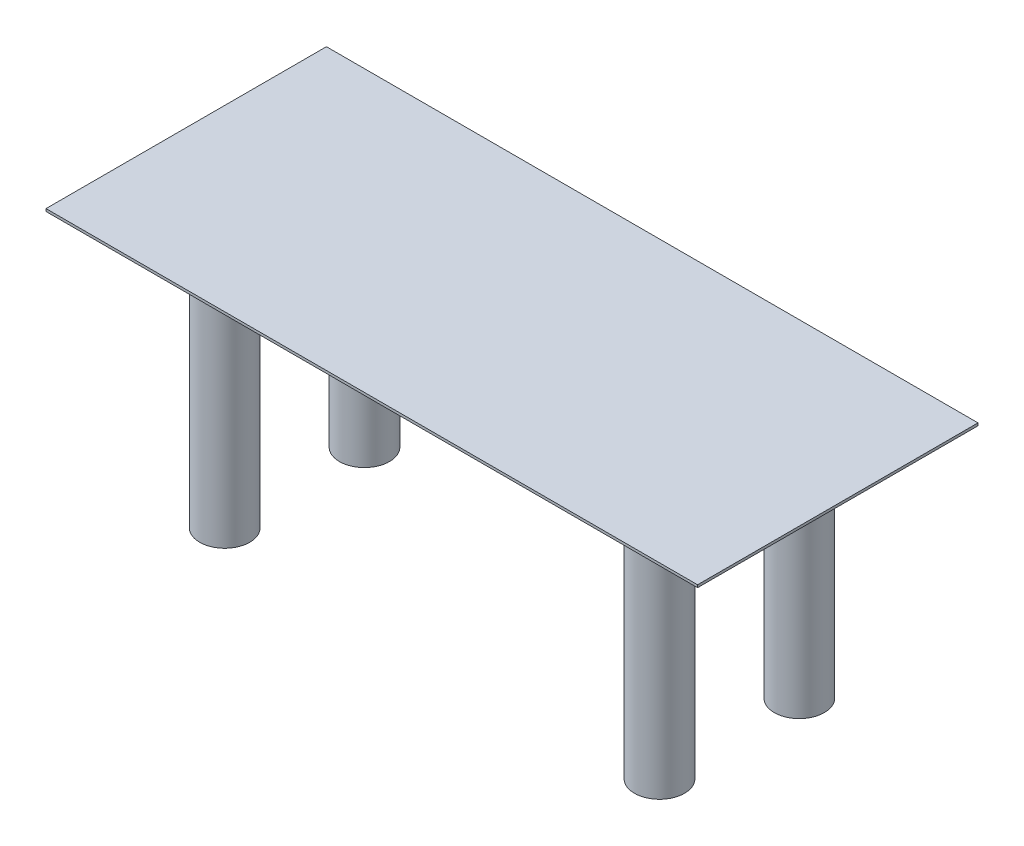
ISO-10303-21;
HEADER;
FILE_DESCRIPTION(('STEP AP214'),'2;1');
FILE_NAME('part.step','',(''),(''),'','','');
FILE_SCHEMA(('AUTOMOTIVE_DESIGN { 1 0 10303 214 1 1 1 1 }'));
ENDSEC;
DATA;
#1=APPLICATION_CONTEXT('core data for automotive mechanical design processes');
#2=APPLICATION_PROTOCOL_DEFINITION('international standard','automotive_design',2000,#1);
#3=PRODUCT_CONTEXT('',#1,'mechanical');
#4=PRODUCT('Part','Part','',(#3));
#5=PRODUCT_RELATED_PRODUCT_CATEGORY('part','',(#4));
#6=PRODUCT_DEFINITION_FORMATION('','',#4);
#7=PRODUCT_DEFINITION_CONTEXT('part definition',#1,'design');
#8=PRODUCT_DEFINITION('design','',#6,#7);
#9=PRODUCT_DEFINITION_SHAPE('','',#8);
#10=(LENGTH_UNIT() NAMED_UNIT(*) SI_UNIT(.MILLI.,.METRE.));
#11=(NAMED_UNIT(*) PLANE_ANGLE_UNIT() SI_UNIT($,.RADIAN.));
#12=(NAMED_UNIT(*) SI_UNIT($,.STERADIAN.) SOLID_ANGLE_UNIT());
#13=UNCERTAINTY_MEASURE_WITH_UNIT(LENGTH_MEASURE(1.E-05),#10,'distance_accuracy_value','');
#14=(GEOMETRIC_REPRESENTATION_CONTEXT(3) GLOBAL_UNCERTAINTY_ASSIGNED_CONTEXT((#13)) GLOBAL_UNIT_ASSIGNED_CONTEXT((#10,
#11,#12)) REPRESENTATION_CONTEXT('',''));
#15=CARTESIAN_POINT('',(0.,0.,0.));
#16=DIRECTION('',(0.,0.,1.));
#17=DIRECTION('',(1.,0.,0.));
#18=AXIS2_PLACEMENT_3D('',#15,#16,#17);
#19=CARTESIAN_POINT('',(1278.,10.,-550.));
#20=DIRECTION('',(-1.,0.,0.));
#21=DIRECTION('',(0.,0.,1.));
#22=AXIS2_PLACEMENT_3D('',#19,#20,#21);
#23=PLANE('',#22);
#24=DIRECTION('',(0.,0.,-1.));
#25=VECTOR('',#24,1.);
#26=CARTESIAN_POINT('',(1278.,0.,-550.));
#27=LINE('',#26,#25);
#28=CARTESIAN_POINT('',(1278.,0.,550.));
#29=VERTEX_POINT('',#28);
#30=CARTESIAN_POINT('',(1278.,0.,-550.));
#31=VERTEX_POINT('',#30);
#32=EDGE_CURVE('E107',#29,#31,#27,.T.);
#33=ORIENTED_EDGE('',*,*,#32,.T.);
#34=DIRECTION('',(0.,-1.,0.));
#35=VECTOR('',#34,1.);
#36=CARTESIAN_POINT('',(1278.,10.,-550.));
#37=LINE('',#36,#35);
#38=CARTESIAN_POINT('',(1278.,10.,-550.));
#39=VERTEX_POINT('',#38);
#40=EDGE_CURVE('E98',#39,#31,#37,.T.);
#41=ORIENTED_EDGE('',*,*,#40,.F.);
#42=DIRECTION('',(0.,0.,-1.));
#43=VECTOR('',#42,1.);
#44=CARTESIAN_POINT('',(1278.,10.,-550.));
#45=LINE('',#44,#43);
#46=CARTESIAN_POINT('',(1278.,10.,550.));
#47=VERTEX_POINT('',#46);
#48=EDGE_CURVE('E92',#47,#39,#45,.T.);
#49=ORIENTED_EDGE('',*,*,#48,.F.);
#50=DIRECTION('',(0.,-1.,0.));
#51=VECTOR('',#50,1.);
#52=CARTESIAN_POINT('',(1278.,10.,550.));
#53=LINE('',#52,#51);
#54=EDGE_CURVE('E103',#47,#29,#53,.T.);
#55=ORIENTED_EDGE('',*,*,#54,.T.);
#56=EDGE_LOOP('',(#33,#41,#49,#55));
#57=FACE_BOUND('',#56,.T.);
#58=ADVANCED_FACE('F40',(#57),#23,.F.);
#59=CARTESIAN_POINT('',(-1278.,10.,-550.));
#60=DIRECTION('',(0.,0.,1.));
#61=DIRECTION('',(1.,0.,0.));
#62=AXIS2_PLACEMENT_3D('',#59,#60,#61);
#63=PLANE('',#62);
#64=DIRECTION('',(-1.,0.,0.));
#65=VECTOR('',#64,1.);
#66=CARTESIAN_POINT('',(-1278.,0.,-550.));
#67=LINE('',#66,#65);
#68=CARTESIAN_POINT('',(-1278.,0.,-550.));
#69=VERTEX_POINT('',#68);
#70=EDGE_CURVE('E97',#31,#69,#67,.T.);
#71=ORIENTED_EDGE('',*,*,#70,.T.);
#72=DIRECTION('',(0.,-1.,0.));
#73=VECTOR('',#72,1.);
#74=CARTESIAN_POINT('',(-1278.,10.,-550.));
#75=LINE('',#74,#73);
#76=CARTESIAN_POINT('',(-1278.,10.,-550.));
#77=VERTEX_POINT('',#76);
#78=EDGE_CURVE('E95',#77,#69,#75,.T.);
#79=ORIENTED_EDGE('',*,*,#78,.F.);
#80=DIRECTION('',(-1.,0.,0.));
#81=VECTOR('',#80,1.);
#82=CARTESIAN_POINT('',(-1278.,10.,-550.));
#83=LINE('',#82,#81);
#84=EDGE_CURVE('E87',#39,#77,#83,.T.);
#85=ORIENTED_EDGE('',*,*,#84,.F.);
#86=ORIENTED_EDGE('',*,*,#40,.T.);
#87=EDGE_LOOP('',(#71,#79,#85,#86));
#88=FACE_BOUND('',#87,.T.);
#89=ADVANCED_FACE('F96',(#88),#63,.F.);
#90=CARTESIAN_POINT('',(-1278.,10.,-550.));
#91=DIRECTION('',(1.,0.,0.));
#92=DIRECTION('',(0.,0.,-1.));
#93=AXIS2_PLACEMENT_3D('',#90,#91,#92);
#94=PLANE('',#93);
#95=DIRECTION('',(0.,0.,1.));
#96=VECTOR('',#95,1.);
#97=CARTESIAN_POINT('',(-1278.,0.,-550.));
#98=LINE('',#97,#96);
#99=CARTESIAN_POINT('',(-1278.,0.,550.));
#100=VERTEX_POINT('',#99);
#101=EDGE_CURVE('E73',#69,#100,#98,.T.);
#102=ORIENTED_EDGE('',*,*,#101,.T.);
#103=DIRECTION('',(0.,-1.,0.));
#104=VECTOR('',#103,1.);
#105=CARTESIAN_POINT('',(-1278.,10.,550.));
#106=LINE('',#105,#104);
#107=CARTESIAN_POINT('',(-1278.,10.,550.));
#108=VERTEX_POINT('',#107);
#109=EDGE_CURVE('E99',#108,#100,#106,.T.);
#110=ORIENTED_EDGE('',*,*,#109,.F.);
#111=DIRECTION('',(0.,0.,1.));
#112=VECTOR('',#111,1.);
#113=CARTESIAN_POINT('',(-1278.,10.,-550.));
#114=LINE('',#113,#112);
#115=EDGE_CURVE('E90',#77,#108,#114,.T.);
#116=ORIENTED_EDGE('',*,*,#115,.F.);
#117=ORIENTED_EDGE('',*,*,#78,.T.);
#118=EDGE_LOOP('',(#102,#110,#116,#117));
#119=FACE_BOUND('',#118,.T.);
#120=ADVANCED_FACE('F101',(#119),#94,.F.);
#121=CARTESIAN_POINT('',(-1278.,10.,550.));
#122=DIRECTION('',(0.,0.,-1.));
#123=DIRECTION('',(-1.,0.,0.));
#124=AXIS2_PLACEMENT_3D('',#121,#122,#123);
#125=PLANE('',#124);
#126=DIRECTION('',(1.,0.,0.));
#127=VECTOR('',#126,1.);
#128=CARTESIAN_POINT('',(-1278.,0.,550.));
#129=LINE('',#128,#127);
#130=EDGE_CURVE('E79',#100,#29,#129,.T.);
#131=ORIENTED_EDGE('',*,*,#130,.T.);
#132=ORIENTED_EDGE('',*,*,#54,.F.);
#133=DIRECTION('',(1.,0.,0.));
#134=VECTOR('',#133,1.);
#135=CARTESIAN_POINT('',(-1278.,10.,550.));
#136=LINE('',#135,#134);
#137=EDGE_CURVE('E56',#108,#47,#136,.T.);
#138=ORIENTED_EDGE('',*,*,#137,.F.);
#139=ORIENTED_EDGE('',*,*,#109,.T.);
#140=EDGE_LOOP('',(#131,#132,#138,#139));
#141=FACE_BOUND('',#140,.T.);
#142=ADVANCED_FACE('F139',(#141),#125,.F.);
#143=CARTESIAN_POINT('',(0.,10.,0.));
#144=DIRECTION('',(0.,1.,0.));
#145=DIRECTION('',(0.,0.,1.));
#146=AXIS2_PLACEMENT_3D('',#143,#144,#145);
#147=PLANE('',#146);
#148=ORIENTED_EDGE('',*,*,#48,.T.);
#149=ORIENTED_EDGE('',*,*,#84,.T.);
#150=ORIENTED_EDGE('',*,*,#115,.T.);
#151=ORIENTED_EDGE('',*,*,#137,.T.);
#152=EDGE_LOOP('',(#148,#149,#150,#151));
#153=FACE_BOUND('',#152,.T.);
#154=ADVANCED_FACE('F88',(#153),#147,.T.);
#155=CARTESIAN_POINT('',(0.,0.,0.));
#156=DIRECTION('',(0.,1.,0.));
#157=DIRECTION('',(0.,0.,1.));
#158=AXIS2_PLACEMENT_3D('',#155,#156,#157);
#159=PLANE('',#158);
#160=CARTESIAN_POINT('',(-852.850283956366,0.,-274.1840667964));
#161=DIRECTION('',(0.,1.,0.));
#162=DIRECTION('',(0.,0.,1.));
#163=AXIS2_PLACEMENT_3D('',#160,#161,#162);
#164=CIRCLE('',#163,98.1775490113991);
#165=CARTESIAN_POINT('',(-852.850283956366,0.,-176.006517785001));
#166=VERTEX_POINT('',#165);
#167=EDGE_CURVE('E11',#166,#166,#164,.F.);
#168=ORIENTED_EDGE('',*,*,#167,.F.);
#169=EDGE_LOOP('',(#168));
#170=FACE_BOUND('',#169,.T.);
#171=CARTESIAN_POINT('',(852.850283956366,0.,-274.1840667964));
#172=DIRECTION('',(0.,1.,0.));
#173=DIRECTION('',(0.,0.,1.));
#174=AXIS2_PLACEMENT_3D('',#171,#172,#173);
#175=CIRCLE('',#174,98.1775490113991);
#176=CARTESIAN_POINT('',(852.850283956366,0.,-176.006517785001));
#177=VERTEX_POINT('',#176);
#178=EDGE_CURVE('E48',#177,#177,#175,.F.);
#179=ORIENTED_EDGE('',*,*,#178,.F.);
#180=EDGE_LOOP('',(#179));
#181=FACE_BOUND('',#180,.T.);
#182=CARTESIAN_POINT('',(852.850283956366,0.,274.1840667964));
#183=DIRECTION('',(0.,1.,0.));
#184=DIRECTION('',(0.,0.,1.));
#185=AXIS2_PLACEMENT_3D('',#182,#183,#184);
#186=CIRCLE('',#185,98.1775490113991);
#187=CARTESIAN_POINT('',(852.850283956366,0.,372.361615807799));
#188=VERTEX_POINT('',#187);
#189=EDGE_CURVE('E120',#188,#188,#186,.F.);
#190=ORIENTED_EDGE('',*,*,#189,.F.);
#191=EDGE_LOOP('',(#190));
#192=FACE_BOUND('',#191,.T.);
#193=CARTESIAN_POINT('',(-852.850283956366,0.,274.1840667964));
#194=DIRECTION('',(0.,1.,0.));
#195=DIRECTION('',(0.,0.,1.));
#196=AXIS2_PLACEMENT_3D('',#193,#194,#195);
#197=CIRCLE('',#196,98.1775490113991);
#198=CARTESIAN_POINT('',(-852.850283956366,0.,372.3616158078));
#199=VERTEX_POINT('',#198);
#200=EDGE_CURVE('E117',#199,#199,#197,.F.);
#201=ORIENTED_EDGE('',*,*,#200,.F.);
#202=EDGE_LOOP('',(#201));
#203=FACE_BOUND('',#202,.T.);
#204=ORIENTED_EDGE('',*,*,#32,.F.);
#205=ORIENTED_EDGE('',*,*,#130,.F.);
#206=ORIENTED_EDGE('',*,*,#101,.F.);
#207=ORIENTED_EDGE('',*,*,#70,.F.);
#208=EDGE_LOOP('',(#204,#205,#206,#207));
#209=FACE_BOUND('',#208,.T.);
#210=ADVANCED_FACE('F127',(#170,#181,#192,#203,#209),#159,.F.);
#211=CARTESIAN_POINT('',(-852.850283956366,-1000.,274.1840667964));
#212=DIRECTION('',(0.,1.,0.));
#213=DIRECTION('',(0.,0.,1.));
#214=AXIS2_PLACEMENT_3D('',#211,#212,#213);
#215=CYLINDRICAL_SURFACE('',#214,98.1775490113991);
#216=CARTESIAN_POINT('',(-852.850283956366,-1000.,274.1840667964));
#217=DIRECTION('',(0.,-1.,0.));
#218=DIRECTION('',(0.,0.,-1.));
#219=AXIS2_PLACEMENT_3D('',#216,#217,#218);
#220=CIRCLE('',#219,98.1775490113991);
#221=CARTESIAN_POINT('',(-852.850283956366,-1000.,176.006517785001));
#222=VERTEX_POINT('',#221);
#223=EDGE_CURVE('E110',#222,#222,#220,.T.);
#224=ORIENTED_EDGE('',*,*,#223,.F.);
#225=EDGE_LOOP('',(#224));
#226=FACE_BOUND('',#225,.T.);
#227=ORIENTED_EDGE('',*,*,#200,.T.);
#228=EDGE_LOOP('',(#227));
#229=FACE_BOUND('',#228,.T.);
#230=ADVANCED_FACE('F130',(#226,#229),#215,.T.);
#231=CARTESIAN_POINT('',(-852.850283956366,-1000.,274.1840667964));
#232=DIRECTION('',(0.,-1.,0.));
#233=DIRECTION('',(0.,0.,-1.));
#234=AXIS2_PLACEMENT_3D('',#231,#232,#233);
#235=PLANE('',#234);
#236=ORIENTED_EDGE('',*,*,#223,.T.);
#237=EDGE_LOOP('',(#236));
#238=FACE_BOUND('',#237,.T.);
#239=ADVANCED_FACE('F187',(#238),#235,.T.);
#240=CARTESIAN_POINT('',(852.850283956366,-1000.,274.1840667964));
#241=DIRECTION('',(0.,1.,0.));
#242=DIRECTION('',(0.,0.,1.));
#243=AXIS2_PLACEMENT_3D('',#240,#241,#242);
#244=CYLINDRICAL_SURFACE('',#243,98.1775490113991);
#245=CARTESIAN_POINT('',(852.850283956366,-1000.,274.1840667964));
#246=DIRECTION('',(0.,-1.,0.));
#247=DIRECTION('',(0.,0.,1.));
#248=AXIS2_PLACEMENT_3D('',#245,#246,#247);
#249=CIRCLE('',#248,98.1775490113991);
#250=CARTESIAN_POINT('',(852.850283956366,-1000.,372.361615807799));
#251=VERTEX_POINT('',#250);
#252=EDGE_CURVE('E296',#251,#251,#249,.T.);
#253=ORIENTED_EDGE('',*,*,#252,.F.);
#254=EDGE_LOOP('',(#253));
#255=FACE_BOUND('',#254,.T.);
#256=ORIENTED_EDGE('',*,*,#189,.T.);
#257=EDGE_LOOP('',(#256));
#258=FACE_BOUND('',#257,.T.);
#259=ADVANCED_FACE('F198',(#255,#258),#244,.T.);
#260=CARTESIAN_POINT('',(852.850283956366,-1000.,274.1840667964));
#261=DIRECTION('',(0.,1.,0.));
#262=DIRECTION('',(0.,0.,1.));
#263=AXIS2_PLACEMENT_3D('',#260,#261,#262);
#264=PLANE('',#263);
#265=ORIENTED_EDGE('',*,*,#252,.T.);
#266=EDGE_LOOP('',(#265));
#267=FACE_BOUND('',#266,.T.);
#268=ADVANCED_FACE('F209',(#267),#264,.F.);
#269=CARTESIAN_POINT('',(852.850283956366,-1000.,-274.1840667964));
#270=DIRECTION('',(0.,1.,0.));
#271=DIRECTION('',(0.,0.,1.));
#272=AXIS2_PLACEMENT_3D('',#269,#270,#271);
#273=CYLINDRICAL_SURFACE('',#272,98.1775490113991);
#274=CARTESIAN_POINT('',(852.850283956366,-1000.,-274.1840667964));
#275=DIRECTION('',(0.,-1.,0.));
#276=DIRECTION('',(0.,0.,-1.));
#277=AXIS2_PLACEMENT_3D('',#274,#275,#276);
#278=CIRCLE('',#277,98.1775490113991);
#279=CARTESIAN_POINT('',(852.850283956366,-1000.,-372.361615807799));
#280=VERTEX_POINT('',#279);
#281=EDGE_CURVE('E293',#280,#280,#278,.T.);
#282=ORIENTED_EDGE('',*,*,#281,.F.);
#283=EDGE_LOOP('',(#282));
#284=FACE_BOUND('',#283,.T.);
#285=ORIENTED_EDGE('',*,*,#178,.T.);
#286=EDGE_LOOP('',(#285));
#287=FACE_BOUND('',#286,.T.);
#288=ADVANCED_FACE('F125',(#284,#287),#273,.T.);
#289=CARTESIAN_POINT('',(852.850283956366,-1000.,-274.1840667964));
#290=DIRECTION('',(0.,-1.,0.));
#291=DIRECTION('',(0.,0.,-1.));
#292=AXIS2_PLACEMENT_3D('',#289,#290,#291);
#293=PLANE('',#292);
#294=ORIENTED_EDGE('',*,*,#281,.T.);
#295=EDGE_LOOP('',(#294));
#296=FACE_BOUND('',#295,.T.);
#297=ADVANCED_FACE('F230',(#296),#293,.T.);
#298=CARTESIAN_POINT('',(-852.850283956366,-1000.,-274.1840667964));
#299=DIRECTION('',(0.,1.,0.));
#300=DIRECTION('',(0.,0.,1.));
#301=AXIS2_PLACEMENT_3D('',#298,#299,#300);
#302=CYLINDRICAL_SURFACE('',#301,98.1775490113991);
#303=CARTESIAN_POINT('',(-852.850283956366,-1000.,-274.1840667964));
#304=DIRECTION('',(0.,-1.,0.));
#305=DIRECTION('',(0.,0.,1.));
#306=AXIS2_PLACEMENT_3D('',#303,#304,#305);
#307=CIRCLE('',#306,98.1775490113991);
#308=CARTESIAN_POINT('',(-852.850283956366,-1000.,-176.006517785001));
#309=VERTEX_POINT('',#308);
#310=EDGE_CURVE('E292',#309,#309,#307,.T.);
#311=ORIENTED_EDGE('',*,*,#310,.F.);
#312=EDGE_LOOP('',(#311));
#313=FACE_BOUND('',#312,.T.);
#314=ORIENTED_EDGE('',*,*,#167,.T.);
#315=EDGE_LOOP('',(#314));
#316=FACE_BOUND('',#315,.T.);
#317=ADVANCED_FACE('F241',(#313,#316),#302,.T.);
#318=CARTESIAN_POINT('',(-852.850283956366,-1000.,-274.1840667964));
#319=DIRECTION('',(0.,1.,0.));
#320=DIRECTION('',(0.,0.,1.));
#321=AXIS2_PLACEMENT_3D('',#318,#319,#320);
#322=PLANE('',#321);
#323=ORIENTED_EDGE('',*,*,#310,.T.);
#324=EDGE_LOOP('',(#323));
#325=FACE_BOUND('',#324,.T.);
#326=ADVANCED_FACE('F252',(#325),#322,.F.);
#327=CLOSED_SHELL('',(#58,#89,#120,#142,#154,#210,#230,#239,#259,#268,#288,#297,#317,#326));
#328=MANIFOLD_SOLID_BREP('B2',#327);
#329=ADVANCED_BREP_SHAPE_REPRESENTATION('',(#18,#328),#14);
#330=SHAPE_DEFINITION_REPRESENTATION(#9,#329);
ENDSEC;
END-ISO-10303-21;
